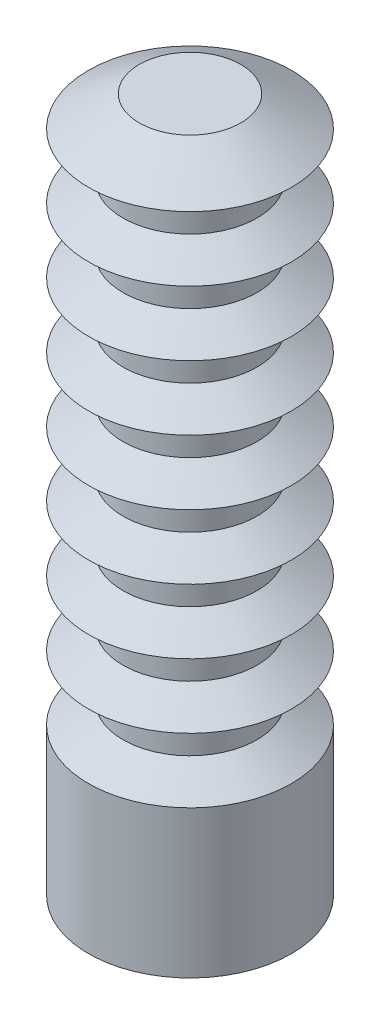
ISO-10303-21;
HEADER;
FILE_DESCRIPTION(('STEP AP214'),'2;1');
FILE_NAME('part.step','',(''),(''),'','','');
FILE_SCHEMA(('AUTOMOTIVE_DESIGN { 1 0 10303 214 1 1 1 1 }'));
ENDSEC;
DATA;
#1=APPLICATION_CONTEXT('core data for automotive mechanical design processes');
#2=APPLICATION_PROTOCOL_DEFINITION('international standard','automotive_design',2000,#1);
#3=PRODUCT_CONTEXT('',#1,'mechanical');
#4=PRODUCT('Part','Part','',(#3));
#5=PRODUCT_RELATED_PRODUCT_CATEGORY('part','',(#4));
#6=PRODUCT_DEFINITION_FORMATION('','',#4);
#7=PRODUCT_DEFINITION_CONTEXT('part definition',#1,'design');
#8=PRODUCT_DEFINITION('design','',#6,#7);
#9=PRODUCT_DEFINITION_SHAPE('','',#8);
#10=(LENGTH_UNIT() NAMED_UNIT(*) SI_UNIT(.MILLI.,.METRE.));
#11=(NAMED_UNIT(*) PLANE_ANGLE_UNIT() SI_UNIT($,.RADIAN.));
#12=(NAMED_UNIT(*) SI_UNIT($,.STERADIAN.) SOLID_ANGLE_UNIT());
#13=UNCERTAINTY_MEASURE_WITH_UNIT(LENGTH_MEASURE(1.E-05),#10,'distance_accuracy_value','');
#14=(GEOMETRIC_REPRESENTATION_CONTEXT(3) GLOBAL_UNCERTAINTY_ASSIGNED_CONTEXT((#13)) GLOBAL_UNIT_ASSIGNED_CONTEXT((#10,
#11,#12)) REPRESENTATION_CONTEXT('',''));
#15=CARTESIAN_POINT('',(0.,0.,0.));
#16=DIRECTION('',(0.,0.,1.));
#17=DIRECTION('',(1.,0.,0.));
#18=AXIS2_PLACEMENT_3D('',#15,#16,#17);
#19=CARTESIAN_POINT('',(-5.43163068128709,7.9600000000012,0.));
#20=DIRECTION('',(0.,-1.,0.));
#21=DIRECTION('',(1.,0.,0.));
#22=AXIS2_PLACEMENT_3D('',#19,#20,#21);
#23=CONICAL_SURFACE('',#22,2.29276466619503,1.02132101334301);
#24=CARTESIAN_POINT('',(-5.43163068128709,7.25999999999998,0.));
#25=DIRECTION('',(0.,1.,0.));
#26=DIRECTION('',(-1.,0.,0.));
#27=AXIS2_PLACEMENT_3D('',#24,#25,#26);
#28=CIRCLE('',#27,3.43583917012011);
#29=CARTESIAN_POINT('',(-8.86746985140721,7.25999999999998,0.));
#30=VERTEX_POINT('',#29);
#31=EDGE_CURVE('E10',#30,#30,#28,.T.);
#32=ORIENTED_EDGE('',*,*,#31,.F.);
#33=EDGE_LOOP('',(#32));
#34=FACE_BOUND('',#33,.T.);
#35=CARTESIAN_POINT('',(-5.43163068128709,7.9600000000012,0.));
#36=DIRECTION('',(0.,1.,0.));
#37=DIRECTION('',(-1.,0.,0.));
#38=AXIS2_PLACEMENT_3D('',#35,#36,#37);
#39=CIRCLE('',#38,2.29276466619503);
#40=CARTESIAN_POINT('',(-7.72439534748212,7.9600000000012,0.));
#41=VERTEX_POINT('',#40);
#42=EDGE_CURVE('E201',#41,#41,#39,.T.);
#43=ORIENTED_EDGE('',*,*,#42,.T.);
#44=EDGE_LOOP('',(#43));
#45=FACE_BOUND('',#44,.T.);
#46=ADVANCED_FACE('F32',(#34,#45),#23,.F.);
#47=CARTESIAN_POINT('',(-5.43163068128709,7.25999999999998,0.));
#48=DIRECTION('',(0.,-1.,0.));
#49=DIRECTION('',(1.,0.,0.));
#50=AXIS2_PLACEMENT_3D('',#47,#48,#49);
#51=CONICAL_SURFACE('',#50,3.43583917012011,1.0250940475705);
#52=CARTESIAN_POINT('',(-5.43163068128709,6.79599581917428,0.));
#53=DIRECTION('',(0.,1.,0.));
#54=DIRECTION('',(-1.,0.,0.));
#55=AXIS2_PLACEMENT_3D('',#52,#53,#54);
#56=CIRCLE('',#55,4.2);
#57=CARTESIAN_POINT('',(-9.63163068128709,6.79599581917428,0.));
#58=VERTEX_POINT('',#57);
#59=EDGE_CURVE('E38',#58,#58,#56,.T.);
#60=ORIENTED_EDGE('',*,*,#59,.F.);
#61=EDGE_LOOP('',(#60));
#62=FACE_BOUND('',#61,.T.);
#63=ORIENTED_EDGE('',*,*,#31,.T.);
#64=EDGE_LOOP('',(#63));
#65=FACE_BOUND('',#64,.T.);
#66=ADVANCED_FACE('F218',(#62,#65),#51,.F.);
#67=CARTESIAN_POINT('',(-5.43163068128709,34.1999999999994,0.));
#68=DIRECTION('',(0.,1.,0.));
#69=DIRECTION('',(-1.,0.,0.));
#70=AXIS2_PLACEMENT_3D('',#67,#68,#69);
#71=CYLINDRICAL_SURFACE('',#70,4.2);
#72=ORIENTED_EDGE('',*,*,#59,.T.);
#73=EDGE_LOOP('',(#72));
#74=FACE_BOUND('',#73,.T.);
#75=CARTESIAN_POINT('',(-5.43163068128709,0.,0.));
#76=DIRECTION('',(0.,1.,0.));
#77=DIRECTION('',(-1.,0.,0.));
#78=AXIS2_PLACEMENT_3D('',#75,#76,#77);
#79=CIRCLE('',#78,4.2);
#80=CARTESIAN_POINT('',(-9.63163068128709,0.,0.));
#81=VERTEX_POINT('',#80);
#82=EDGE_CURVE('E42',#81,#81,#79,.T.);
#83=ORIENTED_EDGE('',*,*,#82,.F.);
#84=EDGE_LOOP('',(#83));
#85=FACE_BOUND('',#84,.T.);
#86=ADVANCED_FACE('F223',(#74,#85),#71,.F.);
#87=CARTESIAN_POINT('',(0.,0.,0.));
#88=DIRECTION('',(0.,-1.,0.));
#89=DIRECTION('',(1.,0.,0.));
#90=AXIS2_PLACEMENT_3D('',#87,#88,#89);
#91=PLANE('',#90);
#92=ORIENTED_EDGE('',*,*,#82,.T.);
#93=EDGE_LOOP('',(#92));
#94=FACE_BOUND('',#93,.T.);
#95=CARTESIAN_POINT('',(-5.43163068128709,0.,0.));
#96=DIRECTION('',(0.,1.,0.));
#97=DIRECTION('',(-1.,0.,0.));
#98=AXIS2_PLACEMENT_3D('',#95,#96,#97);
#99=CIRCLE('',#98,5.);
#100=CARTESIAN_POINT('',(-10.4316306812871,0.,0.));
#101=VERTEX_POINT('',#100);
#102=EDGE_CURVE('E46',#101,#101,#99,.T.);
#103=ORIENTED_EDGE('',*,*,#102,.F.);
#104=EDGE_LOOP('',(#103));
#105=FACE_BOUND('',#104,.T.);
#106=ADVANCED_FACE('F228',(#94,#105),#91,.T.);
#107=CARTESIAN_POINT('',(-5.43163068128709,34.1999999999994,0.));
#108=DIRECTION('',(0.,1.,0.));
#109=DIRECTION('',(-1.,0.,0.));
#110=AXIS2_PLACEMENT_3D('',#107,#108,#109);
#111=CYLINDRICAL_SURFACE('',#110,5.00000000000013);
#112=ORIENTED_EDGE('',*,*,#102,.T.);
#113=EDGE_LOOP('',(#112));
#114=FACE_BOUND('',#113,.T.);
#115=CARTESIAN_POINT('',(-5.43163068128709,7.26000000000121,0.));
#116=DIRECTION('',(0.,1.,0.));
#117=DIRECTION('',(-1.,0.,0.));
#118=AXIS2_PLACEMENT_3D('',#115,#116,#117);
#119=CIRCLE('',#118,5.00000000000026);
#120=CARTESIAN_POINT('',(-10.4316306812874,7.26000000000121,0.));
#121=VERTEX_POINT('',#120);
#122=EDGE_CURVE('E51',#121,#121,#119,.T.);
#123=ORIENTED_EDGE('',*,*,#122,.F.);
#124=EDGE_LOOP('',(#123));
#125=FACE_BOUND('',#124,.T.);
#126=ADVANCED_FACE('F233',(#114,#125),#111,.T.);
#127=CARTESIAN_POINT('',(-5.43163068128709,8.28000000000157,0.));
#128=DIRECTION('',(0.,-1.,0.));
#129=DIRECTION('',(1.,0.,0.));
#130=AXIS2_PLACEMENT_3D('',#127,#128,#129);
#131=CONICAL_SURFACE('',#130,3.29999999999811,1.03037682652471);
#132=ORIENTED_EDGE('',*,*,#122,.T.);
#133=EDGE_LOOP('',(#132));
#134=FACE_BOUND('',#133,.T.);
#135=CARTESIAN_POINT('',(-5.43163068128709,8.28000000000157,0.));
#136=DIRECTION('',(0.,1.,0.));
#137=DIRECTION('',(-1.,0.,0.));
#138=AXIS2_PLACEMENT_3D('',#135,#136,#137);
#139=CIRCLE('',#138,3.29999999999811);
#140=CARTESIAN_POINT('',(-8.7316306812852,8.28000000000157,0.));
#141=VERTEX_POINT('',#140);
#142=EDGE_CURVE('E54',#141,#141,#139,.T.);
#143=ORIENTED_EDGE('',*,*,#142,.F.);
#144=EDGE_LOOP('',(#143));
#145=FACE_BOUND('',#144,.T.);
#146=ADVANCED_FACE('F237',(#134,#145),#131,.T.);
#147=CARTESIAN_POINT('',(-5.43163068128709,34.1999999999994,0.));
#148=DIRECTION('',(0.,1.,0.));
#149=DIRECTION('',(-1.,0.,0.));
#150=AXIS2_PLACEMENT_3D('',#147,#148,#149);
#151=CYLINDRICAL_SURFACE('',#150,3.2999999999982);
#152=ORIENTED_EDGE('',*,*,#142,.T.);
#153=EDGE_LOOP('',(#152));
#154=FACE_BOUND('',#153,.T.);
#155=CARTESIAN_POINT('',(-5.43163068128709,9.42000000000347,0.));
#156=DIRECTION('',(0.,1.,0.));
#157=DIRECTION('',(-1.,0.,0.));
#158=AXIS2_PLACEMENT_3D('',#155,#156,#157);
#159=CIRCLE('',#158,3.2999999999983);
#160=CARTESIAN_POINT('',(-8.73163068128539,9.42000000000347,0.));
#161=VERTEX_POINT('',#160);
#162=EDGE_CURVE('E57',#161,#161,#159,.T.);
#163=ORIENTED_EDGE('',*,*,#162,.F.);
#164=EDGE_LOOP('',(#163));
#165=FACE_BOUND('',#164,.T.);
#166=ADVANCED_FACE('F241',(#154,#165),#151,.T.);
#167=CARTESIAN_POINT('',(-5.43163068128709,10.440000000001,0.));
#168=DIRECTION('',(0.,1.,0.));
#169=DIRECTION('',(-1.,0.,0.));
#170=AXIS2_PLACEMENT_3D('',#167,#168,#169);
#171=CONICAL_SURFACE('',#170,5.00000000000023,1.03037682652589);
#172=ORIENTED_EDGE('',*,*,#162,.T.);
#173=EDGE_LOOP('',(#172));
#174=FACE_BOUND('',#173,.T.);
#175=CARTESIAN_POINT('',(-5.43163068128709,10.440000000001,0.));
#176=DIRECTION('',(0.,1.,0.));
#177=DIRECTION('',(-1.,0.,0.));
#178=AXIS2_PLACEMENT_3D('',#175,#176,#177);
#179=CIRCLE('',#178,5.00000000000023);
#180=CARTESIAN_POINT('',(-10.4316306812873,10.440000000001,0.));
#181=VERTEX_POINT('',#180);
#182=EDGE_CURVE('E60',#181,#181,#179,.T.);
#183=ORIENTED_EDGE('',*,*,#182,.F.);
#184=EDGE_LOOP('',(#183));
#185=FACE_BOUND('',#184,.T.);
#186=ADVANCED_FACE('F245',(#174,#185),#171,.T.);
#187=CARTESIAN_POINT('',(-5.43163068128709,11.4600000000014,0.));
#188=DIRECTION('',(0.,-1.,0.));
#189=DIRECTION('',(1.,0.,0.));
#190=AXIS2_PLACEMENT_3D('',#187,#188,#189);
#191=CONICAL_SURFACE('',#190,3.29999999999807,1.03037682652471);
#192=ORIENTED_EDGE('',*,*,#182,.T.);
#193=EDGE_LOOP('',(#192));
#194=FACE_BOUND('',#193,.T.);
#195=CARTESIAN_POINT('',(-5.43163068128709,11.4600000000014,0.));
#196=DIRECTION('',(0.,1.,0.));
#197=DIRECTION('',(-1.,0.,0.));
#198=AXIS2_PLACEMENT_3D('',#195,#196,#197);
#199=CIRCLE('',#198,3.29999999999807);
#200=CARTESIAN_POINT('',(-8.73163068128516,11.4600000000014,0.));
#201=VERTEX_POINT('',#200);
#202=EDGE_CURVE('E63',#201,#201,#199,.T.);
#203=ORIENTED_EDGE('',*,*,#202,.F.);
#204=EDGE_LOOP('',(#203));
#205=FACE_BOUND('',#204,.T.);
#206=ADVANCED_FACE('F249',(#194,#205),#191,.T.);
#207=CARTESIAN_POINT('',(-5.43163068128709,34.1999999999994,0.));
#208=DIRECTION('',(0.,1.,0.));
#209=DIRECTION('',(-1.,0.,0.));
#210=AXIS2_PLACEMENT_3D('',#207,#208,#209);
#211=CYLINDRICAL_SURFACE('',#210,3.29999999999817);
#212=ORIENTED_EDGE('',*,*,#202,.T.);
#213=EDGE_LOOP('',(#212));
#214=FACE_BOUND('',#213,.T.);
#215=CARTESIAN_POINT('',(-5.43163068128709,12.6000000000032,0.));
#216=DIRECTION('',(0.,1.,0.));
#217=DIRECTION('',(-1.,0.,0.));
#218=AXIS2_PLACEMENT_3D('',#215,#216,#217);
#219=CIRCLE('',#218,3.29999999999827);
#220=CARTESIAN_POINT('',(-8.73163068128536,12.6000000000032,0.));
#221=VERTEX_POINT('',#220);
#222=EDGE_CURVE('E66',#221,#221,#219,.T.);
#223=ORIENTED_EDGE('',*,*,#222,.F.);
#224=EDGE_LOOP('',(#223));
#225=FACE_BOUND('',#224,.T.);
#226=ADVANCED_FACE('F253',(#214,#225),#211,.T.);
#227=CARTESIAN_POINT('',(-5.43163068128709,13.6200000000008,0.));
#228=DIRECTION('',(0.,1.,0.));
#229=DIRECTION('',(-1.,0.,0.));
#230=AXIS2_PLACEMENT_3D('',#227,#228,#229);
#231=CONICAL_SURFACE('',#230,5.0000000000002,1.03037682652589);
#232=ORIENTED_EDGE('',*,*,#222,.T.);
#233=EDGE_LOOP('',(#232));
#234=FACE_BOUND('',#233,.T.);
#235=CARTESIAN_POINT('',(-5.43163068128709,13.6200000000008,0.));
#236=DIRECTION('',(0.,1.,0.));
#237=DIRECTION('',(-1.,0.,0.));
#238=AXIS2_PLACEMENT_3D('',#235,#236,#237);
#239=CIRCLE('',#238,5.0000000000002);
#240=CARTESIAN_POINT('',(-10.4316306812873,13.6200000000008,0.));
#241=VERTEX_POINT('',#240);
#242=EDGE_CURVE('E69',#241,#241,#239,.T.);
#243=ORIENTED_EDGE('',*,*,#242,.F.);
#244=EDGE_LOOP('',(#243));
#245=FACE_BOUND('',#244,.T.);
#246=ADVANCED_FACE('F257',(#234,#245),#231,.T.);
#247=CARTESIAN_POINT('',(-5.43163068128709,14.6400000000011,0.));
#248=DIRECTION('',(0.,-1.,0.));
#249=DIRECTION('',(1.,0.,0.));
#250=AXIS2_PLACEMENT_3D('',#247,#248,#249);
#251=CONICAL_SURFACE('',#250,3.29999999999804,1.03037682652471);
#252=ORIENTED_EDGE('',*,*,#242,.T.);
#253=EDGE_LOOP('',(#252));
#254=FACE_BOUND('',#253,.T.);
#255=CARTESIAN_POINT('',(-5.43163068128709,14.6400000000011,0.));
#256=DIRECTION('',(0.,1.,0.));
#257=DIRECTION('',(-1.,0.,0.));
#258=AXIS2_PLACEMENT_3D('',#255,#256,#257);
#259=CIRCLE('',#258,3.29999999999804);
#260=CARTESIAN_POINT('',(-8.73163068128513,14.6400000000011,0.));
#261=VERTEX_POINT('',#260);
#262=EDGE_CURVE('E72',#261,#261,#259,.T.);
#263=ORIENTED_EDGE('',*,*,#262,.F.);
#264=EDGE_LOOP('',(#263));
#265=FACE_BOUND('',#264,.T.);
#266=ADVANCED_FACE('F261',(#254,#265),#251,.T.);
#267=CARTESIAN_POINT('',(-5.43163068128709,34.1999999999994,0.));
#268=DIRECTION('',(0.,1.,0.));
#269=DIRECTION('',(-1.,0.,0.));
#270=AXIS2_PLACEMENT_3D('',#267,#268,#269);
#271=CYLINDRICAL_SURFACE('',#270,3.29999999999814);
#272=ORIENTED_EDGE('',*,*,#262,.T.);
#273=EDGE_LOOP('',(#272));
#274=FACE_BOUND('',#273,.T.);
#275=CARTESIAN_POINT('',(-5.43163068128709,15.780000000003,0.));
#276=DIRECTION('',(0.,1.,0.));
#277=DIRECTION('',(-1.,0.,0.));
#278=AXIS2_PLACEMENT_3D('',#275,#276,#277);
#279=CIRCLE('',#278,3.29999999999824);
#280=CARTESIAN_POINT('',(-8.73163068128533,15.780000000003,0.));
#281=VERTEX_POINT('',#280);
#282=EDGE_CURVE('E75',#281,#281,#279,.T.);
#283=ORIENTED_EDGE('',*,*,#282,.F.);
#284=EDGE_LOOP('',(#283));
#285=FACE_BOUND('',#284,.T.);
#286=ADVANCED_FACE('F265',(#274,#285),#271,.T.);
#287=CARTESIAN_POINT('',(-5.43163068128709,16.8000000000005,0.));
#288=DIRECTION('',(0.,1.,0.));
#289=DIRECTION('',(-1.,0.,0.));
#290=AXIS2_PLACEMENT_3D('',#287,#288,#289);
#291=CONICAL_SURFACE('',#290,5.00000000000017,1.03037682652589);
#292=ORIENTED_EDGE('',*,*,#282,.T.);
#293=EDGE_LOOP('',(#292));
#294=FACE_BOUND('',#293,.T.);
#295=CARTESIAN_POINT('',(-5.43163068128709,16.8000000000005,0.));
#296=DIRECTION('',(0.,1.,0.));
#297=DIRECTION('',(-1.,0.,0.));
#298=AXIS2_PLACEMENT_3D('',#295,#296,#297);
#299=CIRCLE('',#298,5.00000000000017);
#300=CARTESIAN_POINT('',(-10.4316306812873,16.8000000000005,0.));
#301=VERTEX_POINT('',#300);
#302=EDGE_CURVE('E78',#301,#301,#299,.T.);
#303=ORIENTED_EDGE('',*,*,#302,.F.);
#304=EDGE_LOOP('',(#303));
#305=FACE_BOUND('',#304,.T.);
#306=ADVANCED_FACE('F269',(#294,#305),#291,.T.);
#307=CARTESIAN_POINT('',(-5.43163068128709,17.8200000000009,0.));
#308=DIRECTION('',(0.,-1.,0.));
#309=DIRECTION('',(1.,0.,0.));
#310=AXIS2_PLACEMENT_3D('',#307,#308,#309);
#311=CONICAL_SURFACE('',#310,3.29999999999801,1.03037682652471);
#312=ORIENTED_EDGE('',*,*,#302,.T.);
#313=EDGE_LOOP('',(#312));
#314=FACE_BOUND('',#313,.T.);
#315=CARTESIAN_POINT('',(-5.43163068128709,17.8200000000009,0.));
#316=DIRECTION('',(0.,1.,0.));
#317=DIRECTION('',(-1.,0.,0.));
#318=AXIS2_PLACEMENT_3D('',#315,#316,#317);
#319=CIRCLE('',#318,3.29999999999801);
#320=CARTESIAN_POINT('',(-8.7316306812851,17.8200000000009,0.));
#321=VERTEX_POINT('',#320);
#322=EDGE_CURVE('E81',#321,#321,#319,.T.);
#323=ORIENTED_EDGE('',*,*,#322,.F.);
#324=EDGE_LOOP('',(#323));
#325=FACE_BOUND('',#324,.T.);
#326=ADVANCED_FACE('F273',(#314,#325),#311,.T.);
#327=CARTESIAN_POINT('',(-5.43163068128709,34.1999999999994,0.));
#328=DIRECTION('',(0.,1.,0.));
#329=DIRECTION('',(-1.,0.,0.));
#330=AXIS2_PLACEMENT_3D('',#327,#328,#329);
#331=CYLINDRICAL_SURFACE('',#330,3.29999999999811);
#332=ORIENTED_EDGE('',*,*,#322,.T.);
#333=EDGE_LOOP('',(#332));
#334=FACE_BOUND('',#333,.T.);
#335=CARTESIAN_POINT('',(-5.43163068128709,18.9600000000028,0.));
#336=DIRECTION('',(0.,1.,0.));
#337=DIRECTION('',(-1.,0.,0.));
#338=AXIS2_PLACEMENT_3D('',#335,#336,#337);
#339=CIRCLE('',#338,3.2999999999982);
#340=CARTESIAN_POINT('',(-8.7316306812853,18.9600000000028,0.));
#341=VERTEX_POINT('',#340);
#342=EDGE_CURVE('E84',#341,#341,#339,.T.);
#343=ORIENTED_EDGE('',*,*,#342,.F.);
#344=EDGE_LOOP('',(#343));
#345=FACE_BOUND('',#344,.T.);
#346=ADVANCED_FACE('F277',(#334,#345),#331,.T.);
#347=CARTESIAN_POINT('',(-5.43163068128709,19.9800000000003,0.));
#348=DIRECTION('',(0.,1.,0.));
#349=DIRECTION('',(-1.,0.,0.));
#350=AXIS2_PLACEMENT_3D('',#347,#348,#349);
#351=CONICAL_SURFACE('',#350,5.00000000000013,1.03037682652589);
#352=ORIENTED_EDGE('',*,*,#342,.T.);
#353=EDGE_LOOP('',(#352));
#354=FACE_BOUND('',#353,.T.);
#355=CARTESIAN_POINT('',(-5.43163068128709,19.9800000000003,0.));
#356=DIRECTION('',(0.,1.,0.));
#357=DIRECTION('',(-1.,0.,0.));
#358=AXIS2_PLACEMENT_3D('',#355,#356,#357);
#359=CIRCLE('',#358,5.00000000000013);
#360=CARTESIAN_POINT('',(-10.4316306812872,19.9800000000003,0.));
#361=VERTEX_POINT('',#360);
#362=EDGE_CURVE('E87',#361,#361,#359,.T.);
#363=ORIENTED_EDGE('',*,*,#362,.F.);
#364=EDGE_LOOP('',(#363));
#365=FACE_BOUND('',#364,.T.);
#366=ADVANCED_FACE('F281',(#354,#365),#351,.T.);
#367=CARTESIAN_POINT('',(-5.43163068128709,21.0000000000007,0.));
#368=DIRECTION('',(0.,-1.,0.));
#369=DIRECTION('',(1.,0.,0.));
#370=AXIS2_PLACEMENT_3D('',#367,#368,#369);
#371=CONICAL_SURFACE('',#370,3.29999999999797,1.03037682652471);
#372=ORIENTED_EDGE('',*,*,#362,.T.);
#373=EDGE_LOOP('',(#372));
#374=FACE_BOUND('',#373,.T.);
#375=CARTESIAN_POINT('',(-5.43163068128709,21.0000000000007,0.));
#376=DIRECTION('',(0.,1.,0.));
#377=DIRECTION('',(-1.,0.,0.));
#378=AXIS2_PLACEMENT_3D('',#375,#376,#377);
#379=CIRCLE('',#378,3.29999999999797);
#380=CARTESIAN_POINT('',(-8.73163068128507,21.0000000000007,0.));
#381=VERTEX_POINT('',#380);
#382=EDGE_CURVE('E90',#381,#381,#379,.T.);
#383=ORIENTED_EDGE('',*,*,#382,.F.);
#384=EDGE_LOOP('',(#383));
#385=FACE_BOUND('',#384,.T.);
#386=ADVANCED_FACE('F285',(#374,#385),#371,.T.);
#387=CARTESIAN_POINT('',(-5.43163068128709,34.1999999999994,0.));
#388=DIRECTION('',(0.,1.,0.));
#389=DIRECTION('',(-1.,0.,0.));
#390=AXIS2_PLACEMENT_3D('',#387,#388,#389);
#391=CYLINDRICAL_SURFACE('',#390,3.29999999999807);
#392=ORIENTED_EDGE('',*,*,#382,.T.);
#393=EDGE_LOOP('',(#392));
#394=FACE_BOUND('',#393,.T.);
#395=CARTESIAN_POINT('',(-5.43163068128709,22.1400000000026,0.));
#396=DIRECTION('',(0.,1.,0.));
#397=DIRECTION('',(-1.,0.,0.));
#398=AXIS2_PLACEMENT_3D('',#395,#396,#397);
#399=CIRCLE('',#398,3.29999999999817);
#400=CARTESIAN_POINT('',(-8.73163068128526,22.1400000000026,0.));
#401=VERTEX_POINT('',#400);
#402=EDGE_CURVE('E93',#401,#401,#399,.T.);
#403=ORIENTED_EDGE('',*,*,#402,.F.);
#404=EDGE_LOOP('',(#403));
#405=FACE_BOUND('',#404,.T.);
#406=ADVANCED_FACE('F289',(#394,#405),#391,.T.);
#407=CARTESIAN_POINT('',(-5.43163068128709,23.1600000000001,0.));
#408=DIRECTION('',(0.,1.,0.));
#409=DIRECTION('',(-1.,0.,0.));
#410=AXIS2_PLACEMENT_3D('',#407,#408,#409);
#411=CONICAL_SURFACE('',#410,5.0000000000001,1.03037682652589);
#412=ORIENTED_EDGE('',*,*,#402,.T.);
#413=EDGE_LOOP('',(#412));
#414=FACE_BOUND('',#413,.T.);
#415=CARTESIAN_POINT('',(-5.43163068128709,23.1600000000001,0.));
#416=DIRECTION('',(0.,1.,0.));
#417=DIRECTION('',(-1.,0.,0.));
#418=AXIS2_PLACEMENT_3D('',#415,#416,#417);
#419=CIRCLE('',#418,5.0000000000001);
#420=CARTESIAN_POINT('',(-10.4316306812872,23.1600000000001,0.));
#421=VERTEX_POINT('',#420);
#422=EDGE_CURVE('E96',#421,#421,#419,.T.);
#423=ORIENTED_EDGE('',*,*,#422,.F.);
#424=EDGE_LOOP('',(#423));
#425=FACE_BOUND('',#424,.T.);
#426=ADVANCED_FACE('F293',(#414,#425),#411,.T.);
#427=CARTESIAN_POINT('',(-5.43163068128709,24.1800000000005,0.));
#428=DIRECTION('',(0.,-1.,0.));
#429=DIRECTION('',(1.,0.,0.));
#430=AXIS2_PLACEMENT_3D('',#427,#428,#429);
#431=CONICAL_SURFACE('',#430,3.29999999999794,1.03037682652471);
#432=ORIENTED_EDGE('',*,*,#422,.T.);
#433=EDGE_LOOP('',(#432));
#434=FACE_BOUND('',#433,.T.);
#435=CARTESIAN_POINT('',(-5.43163068128709,24.1800000000005,0.));
#436=DIRECTION('',(0.,1.,0.));
#437=DIRECTION('',(-1.,0.,0.));
#438=AXIS2_PLACEMENT_3D('',#435,#436,#437);
#439=CIRCLE('',#438,3.29999999999794);
#440=CARTESIAN_POINT('',(-8.73163068128503,24.1800000000005,0.));
#441=VERTEX_POINT('',#440);
#442=EDGE_CURVE('E99',#441,#441,#439,.T.);
#443=ORIENTED_EDGE('',*,*,#442,.F.);
#444=EDGE_LOOP('',(#443));
#445=FACE_BOUND('',#444,.T.);
#446=ADVANCED_FACE('F297',(#434,#445),#431,.T.);
#447=CARTESIAN_POINT('',(-5.43163068128709,34.1999999999994,0.));
#448=DIRECTION('',(0.,1.,0.));
#449=DIRECTION('',(-1.,0.,0.));
#450=AXIS2_PLACEMENT_3D('',#447,#448,#449);
#451=CYLINDRICAL_SURFACE('',#450,3.29999999999804);
#452=ORIENTED_EDGE('',*,*,#442,.T.);
#453=EDGE_LOOP('',(#452));
#454=FACE_BOUND('',#453,.T.);
#455=CARTESIAN_POINT('',(-5.43163068128709,25.3200000000024,0.));
#456=DIRECTION('',(0.,1.,0.));
#457=DIRECTION('',(-1.,0.,0.));
#458=AXIS2_PLACEMENT_3D('',#455,#456,#457);
#459=CIRCLE('',#458,3.29999999999814);
#460=CARTESIAN_POINT('',(-8.73163068128523,25.3200000000024,0.));
#461=VERTEX_POINT('',#460);
#462=EDGE_CURVE('E102',#461,#461,#459,.T.);
#463=ORIENTED_EDGE('',*,*,#462,.F.);
#464=EDGE_LOOP('',(#463));
#465=FACE_BOUND('',#464,.T.);
#466=ADVANCED_FACE('F301',(#454,#465),#451,.T.);
#467=CARTESIAN_POINT('',(-5.43163068128709,26.3399999999999,0.));
#468=DIRECTION('',(0.,1.,0.));
#469=DIRECTION('',(-1.,0.,0.));
#470=AXIS2_PLACEMENT_3D('',#467,#468,#469);
#471=CONICAL_SURFACE('',#470,5.00000000000007,1.03037682652589);
#472=ORIENTED_EDGE('',*,*,#462,.T.);
#473=EDGE_LOOP('',(#472));
#474=FACE_BOUND('',#473,.T.);
#475=CARTESIAN_POINT('',(-5.43163068128709,26.3399999999999,0.));
#476=DIRECTION('',(0.,1.,0.));
#477=DIRECTION('',(-1.,0.,0.));
#478=AXIS2_PLACEMENT_3D('',#475,#476,#477);
#479=CIRCLE('',#478,5.00000000000007);
#480=CARTESIAN_POINT('',(-10.4316306812872,26.3399999999999,0.));
#481=VERTEX_POINT('',#480);
#482=EDGE_CURVE('E105',#481,#481,#479,.T.);
#483=ORIENTED_EDGE('',*,*,#482,.F.);
#484=EDGE_LOOP('',(#483));
#485=FACE_BOUND('',#484,.T.);
#486=ADVANCED_FACE('F305',(#474,#485),#471,.T.);
#487=CARTESIAN_POINT('',(-5.43163068128709,27.3600000000005,0.));
#488=DIRECTION('',(0.,-1.,0.));
#489=DIRECTION('',(1.,0.,0.));
#490=AXIS2_PLACEMENT_3D('',#487,#488,#489);
#491=CONICAL_SURFACE('',#490,3.29999999999804,1.03037682652458);
#492=ORIENTED_EDGE('',*,*,#482,.T.);
#493=EDGE_LOOP('',(#492));
#494=FACE_BOUND('',#493,.T.);
#495=CARTESIAN_POINT('',(-5.43163068128709,27.3600000000005,0.));
#496=DIRECTION('',(0.,1.,0.));
#497=DIRECTION('',(-1.,0.,0.));
#498=AXIS2_PLACEMENT_3D('',#495,#496,#497);
#499=CIRCLE('',#498,3.29999999999804);
#500=CARTESIAN_POINT('',(-8.73163068128514,27.3600000000005,0.));
#501=VERTEX_POINT('',#500);
#502=EDGE_CURVE('E108',#501,#501,#499,.T.);
#503=ORIENTED_EDGE('',*,*,#502,.F.);
#504=EDGE_LOOP('',(#503));
#505=FACE_BOUND('',#504,.T.);
#506=ADVANCED_FACE('F309',(#494,#505),#491,.T.);
#507=CARTESIAN_POINT('',(-5.43163068128709,34.1999999999994,0.));
#508=DIRECTION('',(0.,1.,0.));
#509=DIRECTION('',(-1.,0.,0.));
#510=AXIS2_PLACEMENT_3D('',#507,#508,#509);
#511=CYLINDRICAL_SURFACE('',#510,3.29999999999807);
#512=ORIENTED_EDGE('',*,*,#502,.T.);
#513=EDGE_LOOP('',(#512));
#514=FACE_BOUND('',#513,.T.);
#515=CARTESIAN_POINT('',(-5.43163068128709,28.5000000000021,0.));
#516=DIRECTION('',(0.,1.,0.));
#517=DIRECTION('',(-1.,0.,0.));
#518=AXIS2_PLACEMENT_3D('',#515,#516,#517);
#519=CIRCLE('',#518,3.29999999999811);
#520=CARTESIAN_POINT('',(-8.7316306812852,28.5000000000021,0.));
#521=VERTEX_POINT('',#520);
#522=EDGE_CURVE('E111',#521,#521,#519,.T.);
#523=ORIENTED_EDGE('',*,*,#522,.F.);
#524=EDGE_LOOP('',(#523));
#525=FACE_BOUND('',#524,.T.);
#526=ADVANCED_FACE('F313',(#514,#525),#511,.T.);
#527=CARTESIAN_POINT('',(-5.43163068128709,29.5199999999997,0.));
#528=DIRECTION('',(0.,1.,0.));
#529=DIRECTION('',(-1.,0.,0.));
#530=AXIS2_PLACEMENT_3D('',#527,#528,#529);
#531=CONICAL_SURFACE('',#530,5.00000000000003,1.03037682652589);
#532=ORIENTED_EDGE('',*,*,#522,.T.);
#533=EDGE_LOOP('',(#532));
#534=FACE_BOUND('',#533,.T.);
#535=CARTESIAN_POINT('',(-5.43163068128709,29.5199999999997,0.));
#536=DIRECTION('',(0.,1.,0.));
#537=DIRECTION('',(-1.,0.,0.));
#538=AXIS2_PLACEMENT_3D('',#535,#536,#537);
#539=CIRCLE('',#538,5.00000000000003);
#540=CARTESIAN_POINT('',(-10.4316306812871,29.5199999999997,0.));
#541=VERTEX_POINT('',#540);
#542=EDGE_CURVE('E114',#541,#541,#539,.T.);
#543=ORIENTED_EDGE('',*,*,#542,.F.);
#544=EDGE_LOOP('',(#543));
#545=FACE_BOUND('',#544,.T.);
#546=ADVANCED_FACE('F317',(#534,#545),#531,.T.);
#547=CARTESIAN_POINT('',(-5.43163068128709,30.54,0.));
#548=DIRECTION('',(0.,-1.,0.));
#549=DIRECTION('',(1.,0.,0.));
#550=AXIS2_PLACEMENT_3D('',#547,#548,#549);
#551=CONICAL_SURFACE('',#550,3.29999999999787,1.03037682652471);
#552=ORIENTED_EDGE('',*,*,#542,.T.);
#553=EDGE_LOOP('',(#552));
#554=FACE_BOUND('',#553,.T.);
#555=CARTESIAN_POINT('',(-5.43163068128709,30.54,0.));
#556=DIRECTION('',(0.,1.,0.));
#557=DIRECTION('',(-1.,0.,0.));
#558=AXIS2_PLACEMENT_3D('',#555,#556,#557);
#559=CIRCLE('',#558,3.29999999999788);
#560=CARTESIAN_POINT('',(-8.73163068128497,30.54,0.));
#561=VERTEX_POINT('',#560);
#562=EDGE_CURVE('E117',#561,#561,#559,.T.);
#563=ORIENTED_EDGE('',*,*,#562,.F.);
#564=EDGE_LOOP('',(#563));
#565=FACE_BOUND('',#564,.T.);
#566=ADVANCED_FACE('F321',(#554,#565),#551,.T.);
#567=CARTESIAN_POINT('',(-5.43163068128709,34.1999999999994,0.));
#568=DIRECTION('',(0.,1.,0.));
#569=DIRECTION('',(-1.,0.,0.));
#570=AXIS2_PLACEMENT_3D('',#567,#568,#569);
#571=CYLINDRICAL_SURFACE('',#570,3.29999999999797);
#572=ORIENTED_EDGE('',*,*,#562,.T.);
#573=EDGE_LOOP('',(#572));
#574=FACE_BOUND('',#573,.T.);
#575=CARTESIAN_POINT('',(-5.43163068128709,31.6800000000019,0.));
#576=DIRECTION('',(0.,1.,0.));
#577=DIRECTION('',(-1.,0.,0.));
#578=AXIS2_PLACEMENT_3D('',#575,#576,#577);
#579=CIRCLE('',#578,3.29999999999807);
#580=CARTESIAN_POINT('',(-8.73163068128517,31.6800000000019,0.));
#581=VERTEX_POINT('',#580);
#582=EDGE_CURVE('E120',#581,#581,#579,.T.);
#583=ORIENTED_EDGE('',*,*,#582,.F.);
#584=EDGE_LOOP('',(#583));
#585=FACE_BOUND('',#584,.T.);
#586=ADVANCED_FACE('F325',(#574,#585),#571,.T.);
#587=CARTESIAN_POINT('',(-5.43163068128709,32.6999999999994,0.));
#588=DIRECTION('',(0.,1.,0.));
#589=DIRECTION('',(-1.,0.,0.));
#590=AXIS2_PLACEMENT_3D('',#587,#588,#589);
#591=CONICAL_SURFACE('',#590,5.,1.03037682652589);
#592=ORIENTED_EDGE('',*,*,#582,.T.);
#593=EDGE_LOOP('',(#592));
#594=FACE_BOUND('',#593,.T.);
#595=CARTESIAN_POINT('',(-5.43163068128709,32.6999999999994,0.));
#596=DIRECTION('',(0.,1.,0.));
#597=DIRECTION('',(-1.,0.,0.));
#598=AXIS2_PLACEMENT_3D('',#595,#596,#597);
#599=CIRCLE('',#598,5.);
#600=CARTESIAN_POINT('',(-10.4316306812871,32.6999999999994,0.));
#601=VERTEX_POINT('',#600);
#602=EDGE_CURVE('E123',#601,#601,#599,.T.);
#603=ORIENTED_EDGE('',*,*,#602,.F.);
#604=EDGE_LOOP('',(#603));
#605=FACE_BOUND('',#604,.T.);
#606=ADVANCED_FACE('F329',(#594,#605),#591,.T.);
#607=CARTESIAN_POINT('',(-5.43163068128709,34.1999999999994,0.));
#608=DIRECTION('',(0.,-1.,0.));
#609=DIRECTION('',(1.,0.,0.));
#610=AXIS2_PLACEMENT_3D('',#607,#608,#609);
#611=CONICAL_SURFACE('',#610,2.5,1.03037682652431);
#612=ORIENTED_EDGE('',*,*,#602,.T.);
#613=EDGE_LOOP('',(#612));
#614=FACE_BOUND('',#613,.T.);
#615=CARTESIAN_POINT('',(-5.43163068128709,34.1999999999994,0.));
#616=DIRECTION('',(0.,1.,0.));
#617=DIRECTION('',(-1.,0.,0.));
#618=AXIS2_PLACEMENT_3D('',#615,#616,#617);
#619=CIRCLE('',#618,2.5);
#620=CARTESIAN_POINT('',(-7.93163068128709,34.1999999999994,0.));
#621=VERTEX_POINT('',#620);
#622=EDGE_CURVE('E126',#621,#621,#619,.T.);
#623=ORIENTED_EDGE('',*,*,#622,.F.);
#624=EDGE_LOOP('',(#623));
#625=FACE_BOUND('',#624,.T.);
#626=ADVANCED_FACE('F333',(#614,#625),#611,.T.);
#627=CARTESIAN_POINT('',(0.,34.1999999999994,0.));
#628=DIRECTION('',(0.,-1.,0.));
#629=DIRECTION('',(1.,0.,0.));
#630=AXIS2_PLACEMENT_3D('',#627,#628,#629);
#631=PLANE('',#630);
#632=ORIENTED_EDGE('',*,*,#622,.T.);
#633=EDGE_LOOP('',(#632));
#634=FACE_BOUND('',#633,.T.);
#635=ADVANCED_FACE('F337',(#634),#631,.F.);
#636=CARTESIAN_POINT('',(0.,33.3999999999994,0.));
#637=DIRECTION('',(0.,1.,0.));
#638=DIRECTION('',(-1.,0.,0.));
#639=AXIS2_PLACEMENT_3D('',#636,#637,#638);
#640=PLANE('',#639);
#641=CARTESIAN_POINT('',(-5.43163068128709,33.3999999999994,0.));
#642=DIRECTION('',(0.,1.,0.));
#643=DIRECTION('',(-1.,0.,0.));
#644=AXIS2_PLACEMENT_3D('',#641,#642,#643);
#645=CIRCLE('',#644,2.29276466619476);
#646=CARTESIAN_POINT('',(-7.72439534748186,33.3999999999994,0.));
#647=VERTEX_POINT('',#646);
#648=EDGE_CURVE('E129',#647,#647,#645,.T.);
#649=ORIENTED_EDGE('',*,*,#648,.F.);
#650=EDGE_LOOP('',(#649));
#651=FACE_BOUND('',#650,.T.);
#652=ADVANCED_FACE('F341',(#651),#640,.F.);
#653=CARTESIAN_POINT('',(-5.43163068128709,32.6999999999982,0.));
#654=DIRECTION('',(0.,-1.,0.));
#655=DIRECTION('',(1.,0.,0.));
#656=AXIS2_PLACEMENT_3D('',#653,#654,#655);
#657=CONICAL_SURFACE('',#656,3.43583917011985,1.02132101334301);
#658=ORIENTED_EDGE('',*,*,#648,.T.);
#659=EDGE_LOOP('',(#658));
#660=FACE_BOUND('',#659,.T.);
#661=CARTESIAN_POINT('',(-5.43163068128709,32.6999999999982,0.));
#662=DIRECTION('',(0.,1.,0.));
#663=DIRECTION('',(-1.,0.,0.));
#664=AXIS2_PLACEMENT_3D('',#661,#662,#663);
#665=CIRCLE('',#664,3.43583917011985);
#666=CARTESIAN_POINT('',(-8.86746985140695,32.6999999999982,0.));
#667=VERTEX_POINT('',#666);
#668=EDGE_CURVE('E132',#667,#667,#665,.T.);
#669=ORIENTED_EDGE('',*,*,#668,.F.);
#670=EDGE_LOOP('',(#669));
#671=FACE_BOUND('',#670,.T.);
#672=ADVANCED_FACE('F345',(#660,#671),#657,.F.);
#673=CARTESIAN_POINT('',(-5.43163068128709,32.014155297645,0.));
#674=DIRECTION('',(0.,1.,0.));
#675=DIRECTION('',(-1.,0.,0.));
#676=AXIS2_PLACEMENT_3D('',#673,#674,#675);
#677=CONICAL_SURFACE('',#676,2.29276466619482,1.03037682652546);
#678=ORIENTED_EDGE('',*,*,#668,.T.);
#679=EDGE_LOOP('',(#678));
#680=FACE_BOUND('',#679,.T.);
#681=CARTESIAN_POINT('',(-5.43163068128709,32.014155297645,0.));
#682=DIRECTION('',(0.,1.,0.));
#683=DIRECTION('',(-1.,0.,0.));
#684=AXIS2_PLACEMENT_3D('',#681,#682,#683);
#685=CIRCLE('',#684,2.29276466619482);
#686=CARTESIAN_POINT('',(-7.72439534748191,32.014155297645,0.));
#687=VERTEX_POINT('',#686);
#688=EDGE_CURVE('E135',#687,#687,#685,.T.);
#689=ORIENTED_EDGE('',*,*,#688,.F.);
#690=EDGE_LOOP('',(#689));
#691=FACE_BOUND('',#690,.T.);
#692=ADVANCED_FACE('F349',(#680,#691),#677,.F.);
#693=CARTESIAN_POINT('',(-5.43163068128709,34.1999999999994,0.));
#694=DIRECTION('',(0.,1.,0.));
#695=DIRECTION('',(-1.,0.,0.));
#696=AXIS2_PLACEMENT_3D('',#693,#694,#695);
#697=CYLINDRICAL_SURFACE('',#696,2.29276466619481);
#698=ORIENTED_EDGE('',*,*,#688,.T.);
#699=EDGE_LOOP('',(#698));
#700=FACE_BOUND('',#699,.T.);
#701=CARTESIAN_POINT('',(-5.43163068128709,30.2199999999997,0.));
#702=DIRECTION('',(0.,1.,0.));
#703=DIRECTION('',(-1.,0.,0.));
#704=AXIS2_PLACEMENT_3D('',#701,#702,#703);
#705=CIRCLE('',#704,2.2927646661948);
#706=CARTESIAN_POINT('',(-7.72439534748189,30.2199999999997,0.));
#707=VERTEX_POINT('',#706);
#708=EDGE_CURVE('E138',#707,#707,#705,.T.);
#709=ORIENTED_EDGE('',*,*,#708,.F.);
#710=EDGE_LOOP('',(#709));
#711=FACE_BOUND('',#710,.T.);
#712=ADVANCED_FACE('F353',(#700,#711),#697,.F.);
#713=CARTESIAN_POINT('',(-5.43163068128709,30.2199999999997,0.));
#714=DIRECTION('',(0.,-1.,0.));
#715=DIRECTION('',(1.,0.,0.));
#716=AXIS2_PLACEMENT_3D('',#713,#714,#715);
#717=CONICAL_SURFACE('',#716,2.2927646661948,1.02132101334301);
#718=CARTESIAN_POINT('',(-5.43163068128709,29.5199999999984,0.));
#719=DIRECTION('',(0.,1.,0.));
#720=DIRECTION('',(-1.,0.,0.));
#721=AXIS2_PLACEMENT_3D('',#718,#719,#720);
#722=CIRCLE('',#721,3.43583917011988);
#723=CARTESIAN_POINT('',(-8.86746985140698,29.5199999999984,0.));
#724=VERTEX_POINT('',#723);
#725=EDGE_CURVE('E141',#724,#724,#722,.T.);
#726=ORIENTED_EDGE('',*,*,#725,.F.);
#727=EDGE_LOOP('',(#726));
#728=FACE_BOUND('',#727,.T.);
#729=ORIENTED_EDGE('',*,*,#708,.T.);
#730=EDGE_LOOP('',(#729));
#731=FACE_BOUND('',#730,.T.);
#732=ADVANCED_FACE('F357',(#728,#731),#717,.F.);
#733=CARTESIAN_POINT('',(-5.43163068128709,28.8341552976452,0.));
#734=DIRECTION('',(0.,1.,0.));
#735=DIRECTION('',(-1.,0.,0.));
#736=AXIS2_PLACEMENT_3D('',#733,#734,#735);
#737=CONICAL_SURFACE('',#736,2.29276466619485,1.03037682652546);
#738=ORIENTED_EDGE('',*,*,#725,.T.);
#739=EDGE_LOOP('',(#738));
#740=FACE_BOUND('',#739,.T.);
#741=CARTESIAN_POINT('',(-5.43163068128709,28.8341552976452,0.));
#742=DIRECTION('',(0.,1.,0.));
#743=DIRECTION('',(-1.,0.,0.));
#744=AXIS2_PLACEMENT_3D('',#741,#742,#743);
#745=CIRCLE('',#744,2.29276466619485);
#746=CARTESIAN_POINT('',(-7.72439534748194,28.8341552976452,0.));
#747=VERTEX_POINT('',#746);
#748=EDGE_CURVE('E144',#747,#747,#745,.T.);
#749=ORIENTED_EDGE('',*,*,#748,.F.);
#750=EDGE_LOOP('',(#749));
#751=FACE_BOUND('',#750,.T.);
#752=ADVANCED_FACE('F361',(#740,#751),#737,.F.);
#753=CARTESIAN_POINT('',(-5.43163068128709,34.1999999999994,0.));
#754=DIRECTION('',(0.,1.,0.));
#755=DIRECTION('',(-1.,0.,0.));
#756=AXIS2_PLACEMENT_3D('',#753,#754,#755);
#757=CYLINDRICAL_SURFACE('',#756,2.29276466619493);
#758=ORIENTED_EDGE('',*,*,#748,.T.);
#759=EDGE_LOOP('',(#758));
#760=FACE_BOUND('',#759,.T.);
#761=CARTESIAN_POINT('',(-5.43163068128709,27.04,0.));
#762=DIRECTION('',(0.,1.,0.));
#763=DIRECTION('',(-1.,0.,0.));
#764=AXIS2_PLACEMENT_3D('',#761,#762,#763);
#765=CIRCLE('',#764,2.29276466619502);
#766=CARTESIAN_POINT('',(-7.72439534748211,27.04,0.));
#767=VERTEX_POINT('',#766);
#768=EDGE_CURVE('E147',#767,#767,#765,.T.);
#769=ORIENTED_EDGE('',*,*,#768,.F.);
#770=EDGE_LOOP('',(#769));
#771=FACE_BOUND('',#770,.T.);
#772=ADVANCED_FACE('F365',(#760,#771),#757,.F.);
#773=CARTESIAN_POINT('',(-5.43163068128709,27.04,0.));
#774=DIRECTION('',(0.,-1.,0.));
#775=DIRECTION('',(1.,0.,0.));
#776=AXIS2_PLACEMENT_3D('',#773,#774,#775);
#777=CONICAL_SURFACE('',#776,2.29276466619502,1.02132101334285);
#778=CARTESIAN_POINT('',(-5.43163068128709,26.3399999999987,0.));
#779=DIRECTION('',(0.,1.,0.));
#780=DIRECTION('',(-1.,0.,0.));
#781=AXIS2_PLACEMENT_3D('',#778,#779,#780);
#782=CIRCLE('',#781,3.43583917011992);
#783=CARTESIAN_POINT('',(-8.86746985140701,26.3399999999987,0.));
#784=VERTEX_POINT('',#783);
#785=EDGE_CURVE('E150',#784,#784,#782,.T.);
#786=ORIENTED_EDGE('',*,*,#785,.F.);
#787=EDGE_LOOP('',(#786));
#788=FACE_BOUND('',#787,.T.);
#789=ORIENTED_EDGE('',*,*,#768,.T.);
#790=EDGE_LOOP('',(#789));
#791=FACE_BOUND('',#790,.T.);
#792=ADVANCED_FACE('F369',(#788,#791),#777,.F.);
#793=CARTESIAN_POINT('',(-5.43163068128709,25.6541552976454,0.));
#794=DIRECTION('',(0.,1.,0.));
#795=DIRECTION('',(-1.,0.,0.));
#796=AXIS2_PLACEMENT_3D('',#793,#794,#795);
#797=CONICAL_SURFACE('',#796,2.29276466619488,1.03037682652546);
#798=ORIENTED_EDGE('',*,*,#785,.T.);
#799=EDGE_LOOP('',(#798));
#800=FACE_BOUND('',#799,.T.);
#801=CARTESIAN_POINT('',(-5.43163068128709,25.6541552976454,0.));
#802=DIRECTION('',(0.,1.,0.));
#803=DIRECTION('',(-1.,0.,0.));
#804=AXIS2_PLACEMENT_3D('',#801,#802,#803);
#805=CIRCLE('',#804,2.29276466619488);
#806=CARTESIAN_POINT('',(-7.72439534748198,25.6541552976454,0.));
#807=VERTEX_POINT('',#806);
#808=EDGE_CURVE('E153',#807,#807,#805,.T.);
#809=ORIENTED_EDGE('',*,*,#808,.F.);
#810=EDGE_LOOP('',(#809));
#811=FACE_BOUND('',#810,.T.);
#812=ADVANCED_FACE('F373',(#800,#811),#797,.F.);
#813=CARTESIAN_POINT('',(-5.43163068128709,34.1999999999994,0.));
#814=DIRECTION('',(0.,1.,0.));
#815=DIRECTION('',(-1.,0.,0.));
#816=AXIS2_PLACEMENT_3D('',#813,#814,#815);
#817=CYLINDRICAL_SURFACE('',#816,2.29276466619497);
#818=ORIENTED_EDGE('',*,*,#808,.T.);
#819=EDGE_LOOP('',(#818));
#820=FACE_BOUND('',#819,.T.);
#821=CARTESIAN_POINT('',(-5.43163068128709,23.86,0.));
#822=DIRECTION('',(0.,1.,0.));
#823=DIRECTION('',(-1.,0.,0.));
#824=AXIS2_PLACEMENT_3D('',#821,#822,#823);
#825=CIRCLE('',#824,2.29276466619505);
#826=CARTESIAN_POINT('',(-7.72439534748214,23.86,0.));
#827=VERTEX_POINT('',#826);
#828=EDGE_CURVE('E156',#827,#827,#825,.T.);
#829=ORIENTED_EDGE('',*,*,#828,.F.);
#830=EDGE_LOOP('',(#829));
#831=FACE_BOUND('',#830,.T.);
#832=ADVANCED_FACE('F377',(#820,#831),#817,.F.);
#833=CARTESIAN_POINT('',(-5.43163068128709,23.86,0.));
#834=DIRECTION('',(0.,-1.,0.));
#835=DIRECTION('',(1.,0.,0.));
#836=AXIS2_PLACEMENT_3D('',#833,#834,#835);
#837=CONICAL_SURFACE('',#836,2.29276466619505,1.02132101334299);
#838=CARTESIAN_POINT('',(-5.43163068128709,23.1599999999989,0.));
#839=DIRECTION('',(0.,1.,0.));
#840=DIRECTION('',(-1.,0.,0.));
#841=AXIS2_PLACEMENT_3D('',#838,#839,#840);
#842=CIRCLE('',#841,3.43583917011995);
#843=CARTESIAN_POINT('',(-8.86746985140704,23.1599999999989,0.));
#844=VERTEX_POINT('',#843);
#845=EDGE_CURVE('E159',#844,#844,#842,.T.);
#846=ORIENTED_EDGE('',*,*,#845,.F.);
#847=EDGE_LOOP('',(#846));
#848=FACE_BOUND('',#847,.T.);
#849=ORIENTED_EDGE('',*,*,#828,.T.);
#850=EDGE_LOOP('',(#849));
#851=FACE_BOUND('',#850,.T.);
#852=ADVANCED_FACE('F381',(#848,#851),#837,.F.);
#853=CARTESIAN_POINT('',(-5.43163068128709,22.4741552976456,0.));
#854=DIRECTION('',(0.,1.,0.));
#855=DIRECTION('',(-1.,0.,0.));
#856=AXIS2_PLACEMENT_3D('',#853,#854,#855);
#857=CONICAL_SURFACE('',#856,2.29276466619492,1.03037682652546);
#858=ORIENTED_EDGE('',*,*,#845,.T.);
#859=EDGE_LOOP('',(#858));
#860=FACE_BOUND('',#859,.T.);
#861=CARTESIAN_POINT('',(-5.43163068128709,22.4741552976456,0.));
#862=DIRECTION('',(0.,1.,0.));
#863=DIRECTION('',(-1.,0.,0.));
#864=AXIS2_PLACEMENT_3D('',#861,#862,#863);
#865=CIRCLE('',#864,2.29276466619492);
#866=CARTESIAN_POINT('',(-7.72439534748201,22.4741552976456,0.));
#867=VERTEX_POINT('',#866);
#868=EDGE_CURVE('E162',#867,#867,#865,.T.);
#869=ORIENTED_EDGE('',*,*,#868,.F.);
#870=EDGE_LOOP('',(#869));
#871=FACE_BOUND('',#870,.T.);
#872=ADVANCED_FACE('F385',(#860,#871),#857,.F.);
#873=CARTESIAN_POINT('',(-5.43163068128709,34.1999999999994,0.));
#874=DIRECTION('',(0.,1.,0.));
#875=DIRECTION('',(-1.,0.,0.));
#876=AXIS2_PLACEMENT_3D('',#873,#874,#875);
#877=CYLINDRICAL_SURFACE('',#876,2.29276466619497);
#878=ORIENTED_EDGE('',*,*,#868,.T.);
#879=EDGE_LOOP('',(#878));
#880=FACE_BOUND('',#879,.T.);
#881=CARTESIAN_POINT('',(-5.43163068128709,20.6800000000005,0.));
#882=DIRECTION('',(0.,1.,0.));
#883=DIRECTION('',(-1.,0.,0.));
#884=AXIS2_PLACEMENT_3D('',#881,#882,#883);
#885=CIRCLE('',#884,2.29276466619502);
#886=CARTESIAN_POINT('',(-7.72439534748211,20.6800000000005,0.));
#887=VERTEX_POINT('',#886);
#888=EDGE_CURVE('E165',#887,#887,#885,.T.);
#889=ORIENTED_EDGE('',*,*,#888,.F.);
#890=EDGE_LOOP('',(#889));
#891=FACE_BOUND('',#890,.T.);
#892=ADVANCED_FACE('F389',(#880,#891),#877,.F.);
#893=CARTESIAN_POINT('',(-5.43163068128709,20.6800000000005,0.));
#894=DIRECTION('',(0.,-1.,0.));
#895=DIRECTION('',(1.,0.,0.));
#896=AXIS2_PLACEMENT_3D('',#893,#894,#895);
#897=CONICAL_SURFACE('',#896,2.29276466619502,1.02132101334286);
#898=CARTESIAN_POINT('',(-5.43163068128709,19.9799999999991,0.));
#899=DIRECTION('',(0.,1.,0.));
#900=DIRECTION('',(-1.,0.,0.));
#901=AXIS2_PLACEMENT_3D('',#898,#899,#900);
#902=CIRCLE('',#901,3.43583917011998);
#903=CARTESIAN_POINT('',(-8.86746985140708,19.9799999999991,0.));
#904=VERTEX_POINT('',#903);
#905=EDGE_CURVE('E168',#904,#904,#902,.T.);
#906=ORIENTED_EDGE('',*,*,#905,.F.);
#907=EDGE_LOOP('',(#906));
#908=FACE_BOUND('',#907,.T.);
#909=ORIENTED_EDGE('',*,*,#888,.T.);
#910=EDGE_LOOP('',(#909));
#911=FACE_BOUND('',#910,.T.);
#912=ADVANCED_FACE('F393',(#908,#911),#897,.F.);
#913=CARTESIAN_POINT('',(-5.43163068128709,19.2941552976459,0.));
#914=DIRECTION('',(0.,1.,0.));
#915=DIRECTION('',(-1.,0.,0.));
#916=AXIS2_PLACEMENT_3D('',#913,#914,#915);
#917=CONICAL_SURFACE('',#916,2.29276466619495,1.03037682652546);
#918=ORIENTED_EDGE('',*,*,#905,.T.);
#919=EDGE_LOOP('',(#918));
#920=FACE_BOUND('',#919,.T.);
#921=CARTESIAN_POINT('',(-5.43163068128709,19.2941552976459,0.));
#922=DIRECTION('',(0.,1.,0.));
#923=DIRECTION('',(-1.,0.,0.));
#924=AXIS2_PLACEMENT_3D('',#921,#922,#923);
#925=CIRCLE('',#924,2.29276466619495);
#926=CARTESIAN_POINT('',(-7.72439534748204,19.2941552976459,0.));
#927=VERTEX_POINT('',#926);
#928=EDGE_CURVE('E171',#927,#927,#925,.T.);
#929=ORIENTED_EDGE('',*,*,#928,.F.);
#930=EDGE_LOOP('',(#929));
#931=FACE_BOUND('',#930,.T.);
#932=ADVANCED_FACE('F397',(#920,#931),#917,.F.);
#933=CARTESIAN_POINT('',(-5.43163068128709,34.1999999999994,0.));
#934=DIRECTION('',(0.,1.,0.));
#935=DIRECTION('',(-1.,0.,0.));
#936=AXIS2_PLACEMENT_3D('',#933,#934,#935);
#937=CYLINDRICAL_SURFACE('',#936,2.29276466619494);
#938=ORIENTED_EDGE('',*,*,#928,.T.);
#939=EDGE_LOOP('',(#938));
#940=FACE_BOUND('',#939,.T.);
#941=CARTESIAN_POINT('',(-5.43163068128709,17.5000000000005,0.));
#942=DIRECTION('',(0.,1.,0.));
#943=DIRECTION('',(-1.,0.,0.));
#944=AXIS2_PLACEMENT_3D('',#941,#942,#943);
#945=CIRCLE('',#944,2.29276466619493);
#946=CARTESIAN_POINT('',(-7.72439534748202,17.5000000000005,0.));
#947=VERTEX_POINT('',#946);
#948=EDGE_CURVE('E174',#947,#947,#945,.T.);
#949=ORIENTED_EDGE('',*,*,#948,.F.);
#950=EDGE_LOOP('',(#949));
#951=FACE_BOUND('',#950,.T.);
#952=ADVANCED_FACE('F401',(#940,#951),#937,.F.);
#953=CARTESIAN_POINT('',(-5.43163068128709,17.5000000000005,0.));
#954=DIRECTION('',(0.,-1.,0.));
#955=DIRECTION('',(1.,0.,0.));
#956=AXIS2_PLACEMENT_3D('',#953,#954,#955);
#957=CONICAL_SURFACE('',#956,2.29276466619493,1.02132101334318);
#958=CARTESIAN_POINT('',(-5.43163068128709,16.7999999999995,0.));
#959=DIRECTION('',(0.,1.,0.));
#960=DIRECTION('',(-1.,0.,0.));
#961=AXIS2_PLACEMENT_3D('',#958,#959,#960);
#962=CIRCLE('',#961,3.43583917012007);
#963=CARTESIAN_POINT('',(-8.86746985140716,16.7999999999995,0.));
#964=VERTEX_POINT('',#963);
#965=EDGE_CURVE('E177',#964,#964,#962,.T.);
#966=ORIENTED_EDGE('',*,*,#965,.F.);
#967=EDGE_LOOP('',(#966));
#968=FACE_BOUND('',#967,.T.);
#969=ORIENTED_EDGE('',*,*,#948,.T.);
#970=EDGE_LOOP('',(#969));
#971=FACE_BOUND('',#970,.T.);
#972=ADVANCED_FACE('F405',(#968,#971),#957,.F.);
#973=CARTESIAN_POINT('',(-5.43163068128709,16.1141552976463,0.));
#974=DIRECTION('',(0.,1.,0.));
#975=DIRECTION('',(-1.,0.,0.));
#976=AXIS2_PLACEMENT_3D('',#973,#974,#975);
#977=CONICAL_SURFACE('',#976,2.29276466619504,1.03037682652546);
#978=ORIENTED_EDGE('',*,*,#965,.T.);
#979=EDGE_LOOP('',(#978));
#980=FACE_BOUND('',#979,.T.);
#981=CARTESIAN_POINT('',(-5.43163068128709,16.1141552976463,0.));
#982=DIRECTION('',(0.,1.,0.));
#983=DIRECTION('',(-1.,0.,0.));
#984=AXIS2_PLACEMENT_3D('',#981,#982,#983);
#985=CIRCLE('',#984,2.29276466619504);
#986=CARTESIAN_POINT('',(-7.72439534748213,16.1141552976463,0.));
#987=VERTEX_POINT('',#986);
#988=EDGE_CURVE('E180',#987,#987,#985,.T.);
#989=ORIENTED_EDGE('',*,*,#988,.F.);
#990=EDGE_LOOP('',(#989));
#991=FACE_BOUND('',#990,.T.);
#992=ADVANCED_FACE('F409',(#980,#991),#977,.F.);
#993=CARTESIAN_POINT('',(-5.43163068128709,34.1999999999994,0.));
#994=DIRECTION('',(0.,1.,0.));
#995=DIRECTION('',(-1.,0.,0.));
#996=AXIS2_PLACEMENT_3D('',#993,#994,#995);
#997=CYLINDRICAL_SURFACE('',#996,2.292764666195);
#998=ORIENTED_EDGE('',*,*,#988,.T.);
#999=EDGE_LOOP('',(#998));
#1000=FACE_BOUND('',#999,.T.);
#1001=CARTESIAN_POINT('',(-5.43163068128709,14.3200000000008,0.));
#1002=DIRECTION('',(0.,1.,0.));
#1003=DIRECTION('',(-1.,0.,0.));
#1004=AXIS2_PLACEMENT_3D('',#1001,#1002,#1003);
#1005=CIRCLE('',#1004,2.29276466619496);
#1006=CARTESIAN_POINT('',(-7.72439534748205,14.3200000000008,0.));
#1007=VERTEX_POINT('',#1006);
#1008=EDGE_CURVE('E183',#1007,#1007,#1005,.T.);
#1009=ORIENTED_EDGE('',*,*,#1008,.F.);
#1010=EDGE_LOOP('',(#1009));
#1011=FACE_BOUND('',#1010,.T.);
#1012=ADVANCED_FACE('F413',(#1000,#1011),#997,.F.);
#1013=CARTESIAN_POINT('',(-5.43163068128709,14.3200000000008,0.));
#1014=DIRECTION('',(0.,-1.,0.));
#1015=DIRECTION('',(1.,0.,0.));
#1016=AXIS2_PLACEMENT_3D('',#1013,#1014,#1015);
#1017=CONICAL_SURFACE('',#1016,2.29276466619496,1.02132101334304);
#1018=CARTESIAN_POINT('',(-5.43163068128709,13.6199999999995,0.));
#1019=DIRECTION('',(0.,1.,0.));
#1020=DIRECTION('',(-1.,0.,0.));
#1021=AXIS2_PLACEMENT_3D('',#1018,#1019,#1020);
#1022=CIRCLE('',#1021,3.4358391701201);
#1023=CARTESIAN_POINT('',(-8.86746985140719,13.6199999999995,0.));
#1024=VERTEX_POINT('',#1023);
#1025=EDGE_CURVE('E186',#1024,#1024,#1022,.T.);
#1026=ORIENTED_EDGE('',*,*,#1025,.F.);
#1027=EDGE_LOOP('',(#1026));
#1028=FACE_BOUND('',#1027,.T.);
#1029=ORIENTED_EDGE('',*,*,#1008,.T.);
#1030=EDGE_LOOP('',(#1029));
#1031=FACE_BOUND('',#1030,.T.);
#1032=ADVANCED_FACE('F417',(#1028,#1031),#1017,.F.);
#1033=CARTESIAN_POINT('',(-5.43163068128709,12.9341552976463,0.));
#1034=DIRECTION('',(0.,1.,0.));
#1035=DIRECTION('',(-1.,0.,0.));
#1036=AXIS2_PLACEMENT_3D('',#1033,#1034,#1035);
#1037=CONICAL_SURFACE('',#1036,2.29276466619507,1.03037682652546);
#1038=ORIENTED_EDGE('',*,*,#1025,.T.);
#1039=EDGE_LOOP('',(#1038));
#1040=FACE_BOUND('',#1039,.T.);
#1041=CARTESIAN_POINT('',(-5.43163068128709,12.9341552976463,0.));
#1042=DIRECTION('',(0.,1.,0.));
#1043=DIRECTION('',(-1.,0.,0.));
#1044=AXIS2_PLACEMENT_3D('',#1041,#1042,#1043);
#1045=CIRCLE('',#1044,2.29276466619507);
#1046=CARTESIAN_POINT('',(-7.72439534748216,12.9341552976463,0.));
#1047=VERTEX_POINT('',#1046);
#1048=EDGE_CURVE('E189',#1047,#1047,#1045,.T.);
#1049=ORIENTED_EDGE('',*,*,#1048,.F.);
#1050=EDGE_LOOP('',(#1049));
#1051=FACE_BOUND('',#1050,.T.);
#1052=ADVANCED_FACE('F421',(#1040,#1051),#1037,.F.);
#1053=CARTESIAN_POINT('',(-5.43163068128709,34.1999999999994,0.));
#1054=DIRECTION('',(0.,1.,0.));
#1055=DIRECTION('',(-1.,0.,0.));
#1056=AXIS2_PLACEMENT_3D('',#1053,#1054,#1055);
#1057=CYLINDRICAL_SURFACE('',#1056,2.29276466619503);
#1058=ORIENTED_EDGE('',*,*,#1048,.T.);
#1059=EDGE_LOOP('',(#1058));
#1060=FACE_BOUND('',#1059,.T.);
#1061=CARTESIAN_POINT('',(-5.43163068128709,11.140000000001,0.));
#1062=DIRECTION('',(0.,1.,0.));
#1063=DIRECTION('',(-1.,0.,0.));
#1064=AXIS2_PLACEMENT_3D('',#1061,#1062,#1063);
#1065=CIRCLE('',#1064,2.29276466619499);
#1066=CARTESIAN_POINT('',(-7.72439534748209,11.140000000001,0.));
#1067=VERTEX_POINT('',#1066);
#1068=EDGE_CURVE('E192',#1067,#1067,#1065,.T.);
#1069=ORIENTED_EDGE('',*,*,#1068,.F.);
#1070=EDGE_LOOP('',(#1069));
#1071=FACE_BOUND('',#1070,.T.);
#1072=ADVANCED_FACE('F425',(#1060,#1071),#1057,.F.);
#1073=CARTESIAN_POINT('',(-5.43163068128709,11.140000000001,0.));
#1074=DIRECTION('',(0.,-1.,0.));
#1075=DIRECTION('',(1.,0.,0.));
#1076=AXIS2_PLACEMENT_3D('',#1073,#1074,#1075);
#1077=CONICAL_SURFACE('',#1076,2.29276466619499,1.02132101334289);
#1078=CARTESIAN_POINT('',(-5.43163068128709,10.4399999999995,0.));
#1079=DIRECTION('',(0.,1.,0.));
#1080=DIRECTION('',(-1.,0.,0.));
#1081=AXIS2_PLACEMENT_3D('',#1078,#1079,#1080);
#1082=CIRCLE('',#1081,3.43583917012014);
#1083=CARTESIAN_POINT('',(-8.86746985140723,10.4399999999995,0.));
#1084=VERTEX_POINT('',#1083);
#1085=EDGE_CURVE('E195',#1084,#1084,#1082,.T.);
#1086=ORIENTED_EDGE('',*,*,#1085,.F.);
#1087=EDGE_LOOP('',(#1086));
#1088=FACE_BOUND('',#1087,.T.);
#1089=ORIENTED_EDGE('',*,*,#1068,.T.);
#1090=EDGE_LOOP('',(#1089));
#1091=FACE_BOUND('',#1090,.T.);
#1092=ADVANCED_FACE('F214',(#1088,#1091),#1077,.F.);
#1093=CARTESIAN_POINT('',(-5.43163068128709,9.7541552976463,0.));
#1094=DIRECTION('',(0.,1.,0.));
#1095=DIRECTION('',(-1.,0.,0.));
#1096=AXIS2_PLACEMENT_3D('',#1093,#1094,#1095);
#1097=CONICAL_SURFACE('',#1096,2.2927646661951,1.03037682652546);
#1098=ORIENTED_EDGE('',*,*,#1085,.T.);
#1099=EDGE_LOOP('',(#1098));
#1100=FACE_BOUND('',#1099,.T.);
#1101=CARTESIAN_POINT('',(-5.43163068128709,9.7541552976463,0.));
#1102=DIRECTION('',(0.,1.,0.));
#1103=DIRECTION('',(-1.,0.,0.));
#1104=AXIS2_PLACEMENT_3D('',#1101,#1102,#1103);
#1105=CIRCLE('',#1104,2.2927646661951);
#1106=CARTESIAN_POINT('',(-7.72439534748219,9.7541552976463,0.));
#1107=VERTEX_POINT('',#1106);
#1108=EDGE_CURVE('E198',#1107,#1107,#1105,.T.);
#1109=ORIENTED_EDGE('',*,*,#1108,.F.);
#1110=EDGE_LOOP('',(#1109));
#1111=FACE_BOUND('',#1110,.T.);
#1112=ADVANCED_FACE('F208',(#1100,#1111),#1097,.F.);
#1113=CARTESIAN_POINT('',(-5.43163068128709,34.1999999999994,0.));
#1114=DIRECTION('',(0.,1.,0.));
#1115=DIRECTION('',(-1.,0.,0.));
#1116=AXIS2_PLACEMENT_3D('',#1113,#1114,#1115);
#1117=CYLINDRICAL_SURFACE('',#1116,2.29276466619506);
#1118=ORIENTED_EDGE('',*,*,#1108,.T.);
#1119=EDGE_LOOP('',(#1118));
#1120=FACE_BOUND('',#1119,.T.);
#1121=ORIENTED_EDGE('',*,*,#42,.F.);
#1122=EDGE_LOOP('',(#1121));
#1123=FACE_BOUND('',#1122,.T.);
#1124=ADVANCED_FACE('F206',(#1120,#1123),#1117,.F.);
#1125=CLOSED_SHELL('',(#46,#66,#86,#106,#126,#146,#166,#186,#206,#226,#246,#266,#286,#306,#326,
#346,#366,#386,#406,#426,#446,#466,#486,#506,#526,#546,#566,#586,#606,#626,#635,#652,#672,#692,
#712,#732,#752,#772,#792,#812,#832,#852,#872,#892,#912,#932,#952,#972,#992,#1012,#1032,#1052,
#1072,#1092,#1112,#1124));
#1126=MANIFOLD_SOLID_BREP('B2',#1125);
#1127=ADVANCED_BREP_SHAPE_REPRESENTATION('',(#18,#1126),#14);
#1128=SHAPE_DEFINITION_REPRESENTATION(#9,#1127);
ENDSEC;
END-ISO-10303-21;
